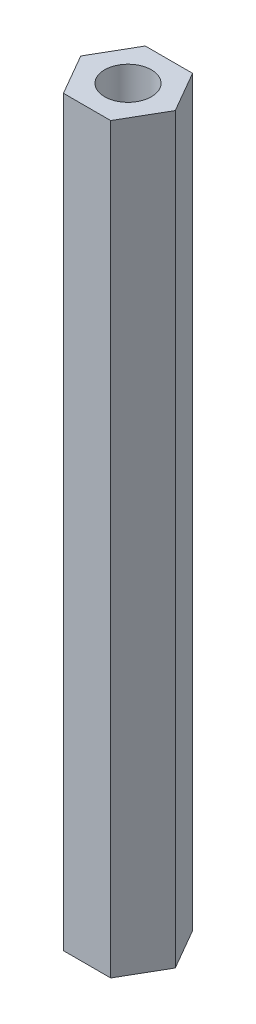
ISO-10303-21;
HEADER;
FILE_DESCRIPTION(('STEP AP214'),'2;1');
FILE_NAME('part.step','',(''),(''),'','','');
FILE_SCHEMA(('AUTOMOTIVE_DESIGN { 1 0 10303 214 1 1 1 1 }'));
ENDSEC;
DATA;
#1=APPLICATION_CONTEXT('core data for automotive mechanical design processes');
#2=APPLICATION_PROTOCOL_DEFINITION('international standard','automotive_design',2000,#1);
#3=PRODUCT_CONTEXT('',#1,'mechanical');
#4=PRODUCT('Part','Part','',(#3));
#5=PRODUCT_RELATED_PRODUCT_CATEGORY('part','',(#4));
#6=PRODUCT_DEFINITION_FORMATION('','',#4);
#7=PRODUCT_DEFINITION_CONTEXT('part definition',#1,'design');
#8=PRODUCT_DEFINITION('design','',#6,#7);
#9=PRODUCT_DEFINITION_SHAPE('','',#8);
#10=(LENGTH_UNIT() NAMED_UNIT(*) SI_UNIT(.MILLI.,.METRE.));
#11=(NAMED_UNIT(*) PLANE_ANGLE_UNIT() SI_UNIT($,.RADIAN.));
#12=(NAMED_UNIT(*) SI_UNIT($,.STERADIAN.) SOLID_ANGLE_UNIT());
#13=UNCERTAINTY_MEASURE_WITH_UNIT(LENGTH_MEASURE(1.E-05),#10,'distance_accuracy_value','');
#14=(GEOMETRIC_REPRESENTATION_CONTEXT(3) GLOBAL_UNCERTAINTY_ASSIGNED_CONTEXT((#13)) GLOBAL_UNIT_ASSIGNED_CONTEXT((#10,
#11,#12)) REPRESENTATION_CONTEXT('',''));
#15=CARTESIAN_POINT('',(0.,0.,0.));
#16=DIRECTION('',(0.,0.,1.));
#17=DIRECTION('',(1.,0.,0.));
#18=AXIS2_PLACEMENT_3D('',#15,#16,#17);
#19=CARTESIAN_POINT('',(0.,63.5,0.));
#20=DIRECTION('',(0.,1.,0.));
#21=DIRECTION('',(0.,0.,1.));
#22=AXIS2_PLACEMENT_3D('',#19,#20,#21);
#23=PLANE('',#22);
#24=DIRECTION('',(-1.,0.,0.));
#25=VECTOR('',#24,1.);
#26=CARTESIAN_POINT('',(2.02072594216369,63.5,-3.5));
#27=LINE('',#26,#25);
#28=CARTESIAN_POINT('',(2.02072594216369,63.5,-3.5));
#29=VERTEX_POINT('',#28);
#30=CARTESIAN_POINT('',(-2.02072594216369,63.5,-3.5));
#31=VERTEX_POINT('',#30);
#32=EDGE_CURVE('E152',#29,#31,#27,.T.);
#33=ORIENTED_EDGE('',*,*,#32,.T.);
#34=DIRECTION('',(-0.5,0.,0.866025403784439));
#35=VECTOR('',#34,1.);
#36=CARTESIAN_POINT('',(-2.02072594216369,63.5,-3.5));
#37=LINE('',#36,#35);
#38=CARTESIAN_POINT('',(-4.04145188432738,63.5,0.));
#39=VERTEX_POINT('',#38);
#40=EDGE_CURVE('E100',#31,#39,#37,.T.);
#41=ORIENTED_EDGE('',*,*,#40,.T.);
#42=DIRECTION('',(0.5,0.,0.866025403784439));
#43=VECTOR('',#42,1.);
#44=CARTESIAN_POINT('',(-4.04145188432738,63.5,0.));
#45=LINE('',#44,#43);
#46=CARTESIAN_POINT('',(-2.02072594216369,63.5,3.5));
#47=VERTEX_POINT('',#46);
#48=EDGE_CURVE('E113',#39,#47,#45,.T.);
#49=ORIENTED_EDGE('',*,*,#48,.T.);
#50=DIRECTION('',(1.,0.,0.));
#51=VECTOR('',#50,1.);
#52=CARTESIAN_POINT('',(-2.02072594216369,63.5,3.5));
#53=LINE('',#52,#51);
#54=CARTESIAN_POINT('',(2.02072594216369,63.5,3.5));
#55=VERTEX_POINT('',#54);
#56=EDGE_CURVE('E107',#47,#55,#53,.T.);
#57=ORIENTED_EDGE('',*,*,#56,.T.);
#58=DIRECTION('',(0.5,0.,-0.866025403784439));
#59=VECTOR('',#58,1.);
#60=CARTESIAN_POINT('',(2.02072594216369,63.5,3.5));
#61=LINE('',#60,#59);
#62=CARTESIAN_POINT('',(4.04145188432738,63.5,0.));
#63=VERTEX_POINT('',#62);
#64=EDGE_CURVE('E111',#55,#63,#61,.T.);
#65=ORIENTED_EDGE('',*,*,#64,.T.);
#66=DIRECTION('',(-0.5,0.,-0.866025403784439));
#67=VECTOR('',#66,1.);
#68=CARTESIAN_POINT('',(4.04145188432738,63.5,0.));
#69=LINE('',#68,#67);
#70=EDGE_CURVE('E63',#63,#29,#69,.T.);
#71=ORIENTED_EDGE('',*,*,#70,.T.);
#72=EDGE_LOOP('',(#33,#41,#49,#57,#65,#71));
#73=FACE_BOUND('',#72,.T.);
#74=CARTESIAN_POINT('',(0.,63.5,0.));
#75=DIRECTION('',(0.,1.,0.));
#76=DIRECTION('',(0.,0.,1.));
#77=AXIS2_PLACEMENT_3D('',#74,#75,#76);
#78=CIRCLE('',#77,2.);
#79=CARTESIAN_POINT('',(0.,63.5,2.));
#80=VERTEX_POINT('',#79);
#81=EDGE_CURVE('E140',#80,#80,#78,.T.);
#82=ORIENTED_EDGE('',*,*,#81,.F.);
#83=EDGE_LOOP('',(#82));
#84=FACE_BOUND('',#83,.T.);
#85=ADVANCED_FACE('F45',(#73,#84),#23,.T.);
#86=CARTESIAN_POINT('',(0.,0.,0.));
#87=DIRECTION('',(0.,1.,0.));
#88=DIRECTION('',(0.,0.,1.));
#89=AXIS2_PLACEMENT_3D('',#86,#87,#88);
#90=PLANE('',#89);
#91=DIRECTION('',(-1.,0.,0.));
#92=VECTOR('',#91,1.);
#93=CARTESIAN_POINT('',(2.02072594216369,0.,-3.5));
#94=LINE('',#93,#92);
#95=CARTESIAN_POINT('',(2.02072594216369,0.,-3.5));
#96=VERTEX_POINT('',#95);
#97=CARTESIAN_POINT('',(-2.02072594216369,0.,-3.5));
#98=VERTEX_POINT('',#97);
#99=EDGE_CURVE('E135',#96,#98,#94,.T.);
#100=ORIENTED_EDGE('',*,*,#99,.F.);
#101=DIRECTION('',(-0.5,0.,-0.866025403784439));
#102=VECTOR('',#101,1.);
#103=CARTESIAN_POINT('',(4.04145188432738,0.,0.));
#104=LINE('',#103,#102);
#105=CARTESIAN_POINT('',(4.04145188432738,0.,0.));
#106=VERTEX_POINT('',#105);
#107=EDGE_CURVE('E92',#106,#96,#104,.T.);
#108=ORIENTED_EDGE('',*,*,#107,.F.);
#109=DIRECTION('',(0.5,0.,-0.866025403784439));
#110=VECTOR('',#109,1.);
#111=CARTESIAN_POINT('',(2.02072594216369,0.,3.5));
#112=LINE('',#111,#110);
#113=CARTESIAN_POINT('',(2.02072594216369,0.,3.5));
#114=VERTEX_POINT('',#113);
#115=EDGE_CURVE('E86',#114,#106,#112,.T.);
#116=ORIENTED_EDGE('',*,*,#115,.F.);
#117=DIRECTION('',(1.,0.,0.));
#118=VECTOR('',#117,1.);
#119=CARTESIAN_POINT('',(-2.02072594216369,0.,3.5));
#120=LINE('',#119,#118);
#121=CARTESIAN_POINT('',(-2.02072594216369,0.,3.5));
#122=VERTEX_POINT('',#121);
#123=EDGE_CURVE('E122',#122,#114,#120,.T.);
#124=ORIENTED_EDGE('',*,*,#123,.F.);
#125=DIRECTION('',(0.5,0.,0.866025403784439));
#126=VECTOR('',#125,1.);
#127=CARTESIAN_POINT('',(-4.04145188432738,0.,0.));
#128=LINE('',#127,#126);
#129=CARTESIAN_POINT('',(-4.04145188432738,0.,0.));
#130=VERTEX_POINT('',#129);
#131=EDGE_CURVE('E143',#130,#122,#128,.T.);
#132=ORIENTED_EDGE('',*,*,#131,.F.);
#133=DIRECTION('',(-0.5,0.,0.866025403784439));
#134=VECTOR('',#133,1.);
#135=CARTESIAN_POINT('',(-2.02072594216369,0.,-3.5));
#136=LINE('',#135,#134);
#137=EDGE_CURVE('E139',#98,#130,#136,.T.);
#138=ORIENTED_EDGE('',*,*,#137,.F.);
#139=EDGE_LOOP('',(#100,#108,#116,#124,#132,#138));
#140=FACE_BOUND('',#139,.T.);
#141=CARTESIAN_POINT('',(0.,0.,0.));
#142=DIRECTION('',(0.,1.,0.));
#143=DIRECTION('',(0.,0.,1.));
#144=AXIS2_PLACEMENT_3D('',#141,#142,#143);
#145=CIRCLE('',#144,2.);
#146=CARTESIAN_POINT('',(0.,0.,2.));
#147=VERTEX_POINT('',#146);
#148=EDGE_CURVE('E249',#147,#147,#145,.T.);
#149=ORIENTED_EDGE('',*,*,#148,.T.);
#150=EDGE_LOOP('',(#149));
#151=FACE_BOUND('',#150,.T.);
#152=ADVANCED_FACE('F165',(#140,#151),#90,.F.);
#153=CARTESIAN_POINT('',(2.02072594216369,63.5,-3.5));
#154=DIRECTION('',(0.,0.,1.));
#155=DIRECTION('',(1.,0.,0.));
#156=AXIS2_PLACEMENT_3D('',#153,#154,#155);
#157=PLANE('',#156);
#158=ORIENTED_EDGE('',*,*,#99,.T.);
#159=DIRECTION('',(0.,-1.,0.));
#160=VECTOR('',#159,1.);
#161=CARTESIAN_POINT('',(-2.02072594216369,63.5,-3.5));
#162=LINE('',#161,#160);
#163=EDGE_CURVE('E11',#31,#98,#162,.T.);
#164=ORIENTED_EDGE('',*,*,#163,.F.);
#165=ORIENTED_EDGE('',*,*,#32,.F.);
#166=DIRECTION('',(0.,-1.,0.));
#167=VECTOR('',#166,1.);
#168=CARTESIAN_POINT('',(2.02072594216369,63.5,-3.5));
#169=LINE('',#168,#167);
#170=EDGE_CURVE('E131',#29,#96,#169,.T.);
#171=ORIENTED_EDGE('',*,*,#170,.T.);
#172=EDGE_LOOP('',(#158,#164,#165,#171));
#173=FACE_BOUND('',#172,.T.);
#174=ADVANCED_FACE('F47',(#173),#157,.F.);
#175=CARTESIAN_POINT('',(-2.02072594216369,63.5,-3.5));
#176=DIRECTION('',(0.866025403784439,0.,0.5));
#177=DIRECTION('',(0.5,0.,-0.866025403784439));
#178=AXIS2_PLACEMENT_3D('',#175,#176,#177);
#179=PLANE('',#178);
#180=ORIENTED_EDGE('',*,*,#137,.T.);
#181=DIRECTION('',(0.,-1.,0.));
#182=VECTOR('',#181,1.);
#183=CARTESIAN_POINT('',(-4.04145188432738,63.5,0.));
#184=LINE('',#183,#182);
#185=EDGE_CURVE('E55',#39,#130,#184,.T.);
#186=ORIENTED_EDGE('',*,*,#185,.F.);
#187=ORIENTED_EDGE('',*,*,#40,.F.);
#188=ORIENTED_EDGE('',*,*,#163,.T.);
#189=EDGE_LOOP('',(#180,#186,#187,#188));
#190=FACE_BOUND('',#189,.T.);
#191=ADVANCED_FACE('F190',(#190),#179,.F.);
#192=CARTESIAN_POINT('',(-4.04145188432738,63.5,0.));
#193=DIRECTION('',(0.866025403784439,0.,-0.5));
#194=DIRECTION('',(-0.5,0.,-0.866025403784439));
#195=AXIS2_PLACEMENT_3D('',#192,#193,#194);
#196=PLANE('',#195);
#197=ORIENTED_EDGE('',*,*,#131,.T.);
#198=DIRECTION('',(0.,-1.,0.));
#199=VECTOR('',#198,1.);
#200=CARTESIAN_POINT('',(-2.02072594216369,63.5,3.5));
#201=LINE('',#200,#199);
#202=EDGE_CURVE('E124',#47,#122,#201,.T.);
#203=ORIENTED_EDGE('',*,*,#202,.F.);
#204=ORIENTED_EDGE('',*,*,#48,.F.);
#205=ORIENTED_EDGE('',*,*,#185,.T.);
#206=EDGE_LOOP('',(#197,#203,#204,#205));
#207=FACE_BOUND('',#206,.T.);
#208=ADVANCED_FACE('F162',(#207),#196,.F.);
#209=CARTESIAN_POINT('',(-2.02072594216369,63.5,3.5));
#210=DIRECTION('',(0.,0.,-1.));
#211=DIRECTION('',(-1.,0.,0.));
#212=AXIS2_PLACEMENT_3D('',#209,#210,#211);
#213=PLANE('',#212);
#214=ORIENTED_EDGE('',*,*,#123,.T.);
#215=DIRECTION('',(0.,-1.,0.));
#216=VECTOR('',#215,1.);
#217=CARTESIAN_POINT('',(2.02072594216369,63.5,3.5));
#218=LINE('',#217,#216);
#219=EDGE_CURVE('E119',#55,#114,#218,.T.);
#220=ORIENTED_EDGE('',*,*,#219,.F.);
#221=ORIENTED_EDGE('',*,*,#56,.F.);
#222=ORIENTED_EDGE('',*,*,#202,.T.);
#223=EDGE_LOOP('',(#214,#220,#221,#222));
#224=FACE_BOUND('',#223,.T.);
#225=ADVANCED_FACE('F120',(#224),#213,.F.);
#226=CARTESIAN_POINT('',(2.02072594216369,63.5,3.5));
#227=DIRECTION('',(-0.866025403784439,0.,-0.5));
#228=DIRECTION('',(-0.5,0.,0.866025403784439));
#229=AXIS2_PLACEMENT_3D('',#226,#227,#228);
#230=PLANE('',#229);
#231=ORIENTED_EDGE('',*,*,#115,.T.);
#232=DIRECTION('',(0.,-1.,0.));
#233=VECTOR('',#232,1.);
#234=CARTESIAN_POINT('',(4.04145188432738,63.5,0.));
#235=LINE('',#234,#233);
#236=EDGE_CURVE('E125',#63,#106,#235,.T.);
#237=ORIENTED_EDGE('',*,*,#236,.F.);
#238=ORIENTED_EDGE('',*,*,#64,.F.);
#239=ORIENTED_EDGE('',*,*,#219,.T.);
#240=EDGE_LOOP('',(#231,#237,#238,#239));
#241=FACE_BOUND('',#240,.T.);
#242=ADVANCED_FACE('F127',(#241),#230,.F.);
#243=CARTESIAN_POINT('',(4.04145188432738,63.5,0.));
#244=DIRECTION('',(-0.866025403784439,0.,0.5));
#245=DIRECTION('',(0.5,0.,0.866025403784439));
#246=AXIS2_PLACEMENT_3D('',#243,#244,#245);
#247=PLANE('',#246);
#248=ORIENTED_EDGE('',*,*,#107,.T.);
#249=ORIENTED_EDGE('',*,*,#170,.F.);
#250=ORIENTED_EDGE('',*,*,#70,.F.);
#251=ORIENTED_EDGE('',*,*,#236,.T.);
#252=EDGE_LOOP('',(#248,#249,#250,#251));
#253=FACE_BOUND('',#252,.T.);
#254=ADVANCED_FACE('F170',(#253),#247,.F.);
#255=CARTESIAN_POINT('',(0.,63.5,0.));
#256=DIRECTION('',(0.,-1.,0.));
#257=DIRECTION('',(0.,0.,-1.));
#258=AXIS2_PLACEMENT_3D('',#255,#256,#257);
#259=CYLINDRICAL_SURFACE('',#258,2.);
#260=ORIENTED_EDGE('',*,*,#81,.T.);
#261=EDGE_LOOP('',(#260));
#262=FACE_BOUND('',#261,.T.);
#263=ORIENTED_EDGE('',*,*,#148,.F.);
#264=EDGE_LOOP('',(#263));
#265=FACE_BOUND('',#264,.T.);
#266=ADVANCED_FACE('F172',(#262,#265),#259,.F.);
#267=CLOSED_SHELL('',(#85,#152,#174,#191,#208,#225,#242,#254,#266));
#268=MANIFOLD_SOLID_BREP('B2',#267);
#269=ADVANCED_BREP_SHAPE_REPRESENTATION('',(#18,#268),#14);
#270=SHAPE_DEFINITION_REPRESENTATION(#9,#269);
ENDSEC;
END-ISO-10303-21;
